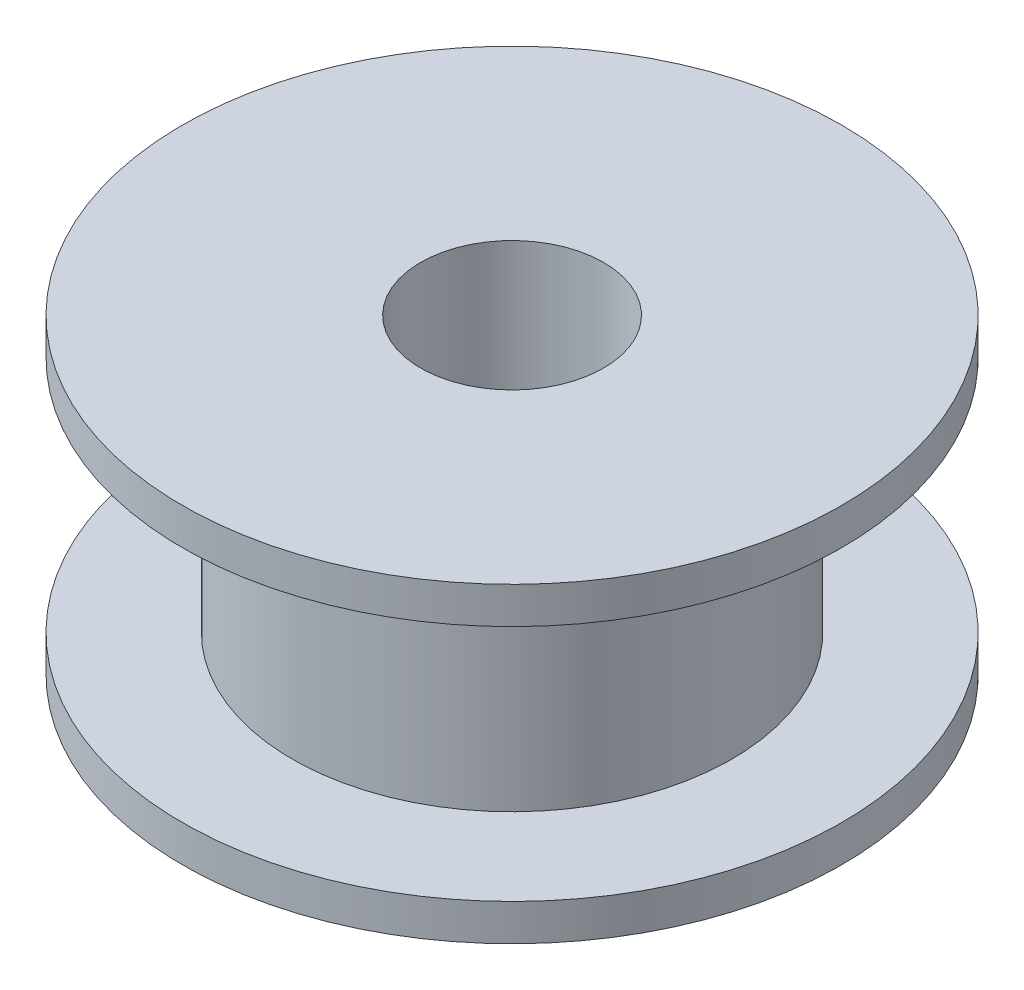
ISO-10303-21;
HEADER;
FILE_DESCRIPTION(('STEP AP214'),'2;1');
FILE_NAME('part.step','',(''),(''),'','','');
FILE_SCHEMA(('AUTOMOTIVE_DESIGN { 1 0 10303 214 1 1 1 1 }'));
ENDSEC;
DATA;
#1=APPLICATION_CONTEXT('core data for automotive mechanical design processes');
#2=APPLICATION_PROTOCOL_DEFINITION('international standard','automotive_design',2000,#1);
#3=PRODUCT_CONTEXT('',#1,'mechanical');
#4=PRODUCT('Part','Part','',(#3));
#5=PRODUCT_RELATED_PRODUCT_CATEGORY('part','',(#4));
#6=PRODUCT_DEFINITION_FORMATION('','',#4);
#7=PRODUCT_DEFINITION_CONTEXT('part definition',#1,'design');
#8=PRODUCT_DEFINITION('design','',#6,#7);
#9=PRODUCT_DEFINITION_SHAPE('','',#8);
#10=(LENGTH_UNIT() NAMED_UNIT(*) SI_UNIT(.MILLI.,.METRE.));
#11=(NAMED_UNIT(*) PLANE_ANGLE_UNIT() SI_UNIT($,.RADIAN.));
#12=(NAMED_UNIT(*) SI_UNIT($,.STERADIAN.) SOLID_ANGLE_UNIT());
#13=UNCERTAINTY_MEASURE_WITH_UNIT(LENGTH_MEASURE(1.E-05),#10,'distance_accuracy_value','');
#14=(GEOMETRIC_REPRESENTATION_CONTEXT(3) GLOBAL_UNCERTAINTY_ASSIGNED_CONTEXT((#13)) GLOBAL_UNIT_ASSIGNED_CONTEXT((#10,
#11,#12)) REPRESENTATION_CONTEXT('',''));
#15=CARTESIAN_POINT('',(0.,0.,0.));
#16=DIRECTION('',(0.,0.,1.));
#17=DIRECTION('',(1.,0.,0.));
#18=AXIS2_PLACEMENT_3D('',#15,#16,#17);
#19=CARTESIAN_POINT('',(-2.5,2.21793537023309,0.));
#20=DIRECTION('',(0.,1.,0.));
#21=DIRECTION('',(0.,0.,1.));
#22=AXIS2_PLACEMENT_3D('',#19,#20,#21);
#23=PLANE('',#22);
#24=CARTESIAN_POINT('',(0.,2.21793537023309,0.));
#25=DIRECTION('',(0.,-1.,0.));
#26=DIRECTION('',(0.,0.,-1.));
#27=AXIS2_PLACEMENT_3D('',#24,#25,#26);
#28=CIRCLE('',#27,2.5);
#29=CARTESIAN_POINT('',(0.,2.21793537023309,-2.5));
#30=VERTEX_POINT('',#29);
#31=EDGE_CURVE('E64',#30,#30,#28,.T.);
#32=ORIENTED_EDGE('',*,*,#31,.F.);
#33=EDGE_LOOP('',(#32));
#34=FACE_BOUND('',#33,.T.);
#35=CARTESIAN_POINT('',(0.,2.21793537023309,0.));
#36=DIRECTION('',(0.,-1.,0.));
#37=DIRECTION('',(0.,0.,-1.));
#38=AXIS2_PLACEMENT_3D('',#35,#36,#37);
#39=CIRCLE('',#38,9.);
#40=CARTESIAN_POINT('',(0.,2.21793537023309,-9.));
#41=VERTEX_POINT('',#40);
#42=EDGE_CURVE('E10',#41,#41,#39,.T.);
#43=ORIENTED_EDGE('',*,*,#42,.T.);
#44=EDGE_LOOP('',(#43));
#45=FACE_BOUND('',#44,.T.);
#46=ADVANCED_FACE('F36',(#34,#45),#23,.F.);
#47=CARTESIAN_POINT('',(0.,0.,0.));
#48=DIRECTION('',(0.,-1.,0.));
#49=DIRECTION('',(0.,0.,-1.));
#50=AXIS2_PLACEMENT_3D('',#47,#48,#49);
#51=CYLINDRICAL_SURFACE('',#50,9.);
#52=ORIENTED_EDGE('',*,*,#42,.F.);
#53=EDGE_LOOP('',(#52));
#54=FACE_BOUND('',#53,.T.);
#55=CARTESIAN_POINT('',(0.,3.21793537023309,0.));
#56=DIRECTION('',(0.,-1.,0.));
#57=DIRECTION('',(0.,0.,-1.));
#58=AXIS2_PLACEMENT_3D('',#55,#56,#57);
#59=CIRCLE('',#58,9.);
#60=CARTESIAN_POINT('',(0.,3.21793537023309,-9.));
#61=VERTEX_POINT('',#60);
#62=EDGE_CURVE('E42',#61,#61,#59,.T.);
#63=ORIENTED_EDGE('',*,*,#62,.T.);
#64=EDGE_LOOP('',(#63));
#65=FACE_BOUND('',#64,.T.);
#66=ADVANCED_FACE('F71',(#54,#65),#51,.T.);
#67=CARTESIAN_POINT('',(-9.,3.21793537023309,0.));
#68=DIRECTION('',(0.,-1.,0.));
#69=DIRECTION('',(0.,0.,-1.));
#70=AXIS2_PLACEMENT_3D('',#67,#68,#69);
#71=PLANE('',#70);
#72=ORIENTED_EDGE('',*,*,#62,.F.);
#73=EDGE_LOOP('',(#72));
#74=FACE_BOUND('',#73,.T.);
#75=CARTESIAN_POINT('',(0.,3.21793537023309,0.));
#76=DIRECTION('',(0.,-1.,0.));
#77=DIRECTION('',(0.,0.,-1.));
#78=AXIS2_PLACEMENT_3D('',#75,#76,#77);
#79=CIRCLE('',#78,6.);
#80=CARTESIAN_POINT('',(0.,3.21793537023309,-6.));
#81=VERTEX_POINT('',#80);
#82=EDGE_CURVE('E46',#81,#81,#79,.T.);
#83=ORIENTED_EDGE('',*,*,#82,.T.);
#84=EDGE_LOOP('',(#83));
#85=FACE_BOUND('',#84,.T.);
#86=ADVANCED_FACE('F75',(#74,#85),#71,.F.);
#87=CARTESIAN_POINT('',(0.,0.,0.));
#88=DIRECTION('',(0.,-1.,0.));
#89=DIRECTION('',(0.,0.,-1.));
#90=AXIS2_PLACEMENT_3D('',#87,#88,#89);
#91=CYLINDRICAL_SURFACE('',#90,6.);
#92=ORIENTED_EDGE('',*,*,#82,.F.);
#93=EDGE_LOOP('',(#92));
#94=FACE_BOUND('',#93,.T.);
#95=CARTESIAN_POINT('',(0.,9.71793537023309,0.));
#96=DIRECTION('',(0.,-1.,0.));
#97=DIRECTION('',(0.,0.,-1.));
#98=AXIS2_PLACEMENT_3D('',#95,#96,#97);
#99=CIRCLE('',#98,6.);
#100=CARTESIAN_POINT('',(0.,9.71793537023309,-6.));
#101=VERTEX_POINT('',#100);
#102=EDGE_CURVE('E50',#101,#101,#99,.T.);
#103=ORIENTED_EDGE('',*,*,#102,.T.);
#104=EDGE_LOOP('',(#103));
#105=FACE_BOUND('',#104,.T.);
#106=ADVANCED_FACE('F80',(#94,#105),#91,.T.);
#107=CARTESIAN_POINT('',(-6.,9.71793537023309,0.));
#108=DIRECTION('',(0.,1.,0.));
#109=DIRECTION('',(0.,0.,1.));
#110=AXIS2_PLACEMENT_3D('',#107,#108,#109);
#111=PLANE('',#110);
#112=ORIENTED_EDGE('',*,*,#102,.F.);
#113=EDGE_LOOP('',(#112));
#114=FACE_BOUND('',#113,.T.);
#115=CARTESIAN_POINT('',(0.,9.71793537023309,0.));
#116=DIRECTION('',(0.,-1.,0.));
#117=DIRECTION('',(0.,0.,-1.));
#118=AXIS2_PLACEMENT_3D('',#115,#116,#117);
#119=CIRCLE('',#118,9.);
#120=CARTESIAN_POINT('',(0.,9.71793537023309,-9.));
#121=VERTEX_POINT('',#120);
#122=EDGE_CURVE('E55',#121,#121,#119,.T.);
#123=ORIENTED_EDGE('',*,*,#122,.T.);
#124=EDGE_LOOP('',(#123));
#125=FACE_BOUND('',#124,.T.);
#126=ADVANCED_FACE('F86',(#114,#125),#111,.F.);
#127=CARTESIAN_POINT('',(0.,0.,0.));
#128=DIRECTION('',(0.,-1.,0.));
#129=DIRECTION('',(0.,0.,-1.));
#130=AXIS2_PLACEMENT_3D('',#127,#128,#129);
#131=CYLINDRICAL_SURFACE('',#130,9.);
#132=ORIENTED_EDGE('',*,*,#122,.F.);
#133=EDGE_LOOP('',(#132));
#134=FACE_BOUND('',#133,.T.);
#135=CARTESIAN_POINT('',(0.,10.7179353702331,0.));
#136=DIRECTION('',(0.,-1.,0.));
#137=DIRECTION('',(0.,0.,-1.));
#138=AXIS2_PLACEMENT_3D('',#135,#136,#137);
#139=CIRCLE('',#138,9.);
#140=CARTESIAN_POINT('',(0.,10.7179353702331,-9.));
#141=VERTEX_POINT('',#140);
#142=EDGE_CURVE('E58',#141,#141,#139,.T.);
#143=ORIENTED_EDGE('',*,*,#142,.T.);
#144=EDGE_LOOP('',(#143));
#145=FACE_BOUND('',#144,.T.);
#146=ADVANCED_FACE('F90',(#134,#145),#131,.T.);
#147=CARTESIAN_POINT('',(-9.,10.7179353702331,0.));
#148=DIRECTION('',(0.,-1.,0.));
#149=DIRECTION('',(0.,0.,-1.));
#150=AXIS2_PLACEMENT_3D('',#147,#148,#149);
#151=PLANE('',#150);
#152=ORIENTED_EDGE('',*,*,#142,.F.);
#153=EDGE_LOOP('',(#152));
#154=FACE_BOUND('',#153,.T.);
#155=CARTESIAN_POINT('',(0.,10.7179353702331,0.));
#156=DIRECTION('',(0.,-1.,0.));
#157=DIRECTION('',(0.,0.,-1.));
#158=AXIS2_PLACEMENT_3D('',#155,#156,#157);
#159=CIRCLE('',#158,2.5);
#160=CARTESIAN_POINT('',(0.,10.7179353702331,-2.5));
#161=VERTEX_POINT('',#160);
#162=EDGE_CURVE('E61',#161,#161,#159,.T.);
#163=ORIENTED_EDGE('',*,*,#162,.T.);
#164=EDGE_LOOP('',(#163));
#165=FACE_BOUND('',#164,.T.);
#166=ADVANCED_FACE('F94',(#154,#165),#151,.F.);
#167=CARTESIAN_POINT('',(0.,0.,0.));
#168=DIRECTION('',(0.,-1.,0.));
#169=DIRECTION('',(0.,0.,-1.));
#170=AXIS2_PLACEMENT_3D('',#167,#168,#169);
#171=CYLINDRICAL_SURFACE('',#170,2.5);
#172=ORIENTED_EDGE('',*,*,#162,.F.);
#173=EDGE_LOOP('',(#172));
#174=FACE_BOUND('',#173,.T.);
#175=ORIENTED_EDGE('',*,*,#31,.T.);
#176=EDGE_LOOP('',(#175));
#177=FACE_BOUND('',#176,.T.);
#178=ADVANCED_FACE('F68',(#174,#177),#171,.F.);
#179=CLOSED_SHELL('',(#46,#66,#86,#106,#126,#146,#166,#178));
#180=MANIFOLD_SOLID_BREP('B2',#179);
#181=ADVANCED_BREP_SHAPE_REPRESENTATION('',(#18,#180),#14);
#182=SHAPE_DEFINITION_REPRESENTATION(#9,#181);
ENDSEC;
END-ISO-10303-21;
